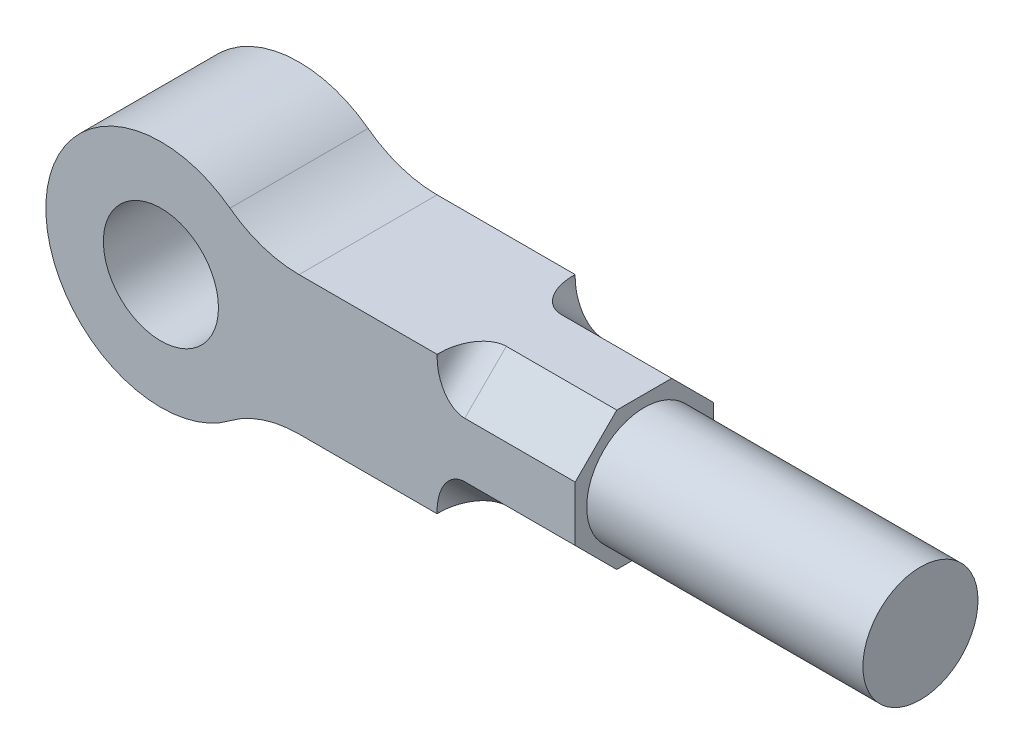
ISO-10303-21;
HEADER;
FILE_DESCRIPTION(('STEP AP214'),'2;1');
FILE_NAME('part.step','',(''),(''),'','','');
FILE_SCHEMA(('AUTOMOTIVE_DESIGN { 1 0 10303 214 1 1 1 1 }'));
ENDSEC;
DATA;
#1=APPLICATION_CONTEXT('core data for automotive mechanical design processes');
#2=APPLICATION_PROTOCOL_DEFINITION('international standard','automotive_design',2000,#1);
#3=PRODUCT_CONTEXT('',#1,'mechanical');
#4=PRODUCT('Part','Part','',(#3));
#5=PRODUCT_RELATED_PRODUCT_CATEGORY('part','',(#4));
#6=PRODUCT_DEFINITION_FORMATION('','',#4);
#7=PRODUCT_DEFINITION_CONTEXT('part definition',#1,'design');
#8=PRODUCT_DEFINITION('design','',#6,#7);
#9=PRODUCT_DEFINITION_SHAPE('','',#8);
#10=(LENGTH_UNIT() NAMED_UNIT(*) SI_UNIT(.MILLI.,.METRE.));
#11=(NAMED_UNIT(*) PLANE_ANGLE_UNIT() SI_UNIT($,.RADIAN.));
#12=(NAMED_UNIT(*) SI_UNIT($,.STERADIAN.) SOLID_ANGLE_UNIT());
#13=UNCERTAINTY_MEASURE_WITH_UNIT(LENGTH_MEASURE(1.E-05),#10,'distance_accuracy_value','');
#14=(GEOMETRIC_REPRESENTATION_CONTEXT(3) GLOBAL_UNCERTAINTY_ASSIGNED_CONTEXT((#13)) GLOBAL_UNIT_ASSIGNED_CONTEXT((#10,
#11,#12)) REPRESENTATION_CONTEXT('',''));
#15=CARTESIAN_POINT('',(0.,0.,0.));
#16=DIRECTION('',(0.,0.,1.));
#17=DIRECTION('',(1.,0.,0.));
#18=AXIS2_PLACEMENT_3D('',#15,#16,#17);
#19=CARTESIAN_POINT('',(0.,0.,600.));
#20=DIRECTION('',(0.,0.,1.));
#21=DIRECTION('',(1.,0.,0.));
#22=AXIS2_PLACEMENT_3D('',#19,#20,#21);
#23=PLANE('',#22);
#24=DIRECTION('',(0.,-1.,0.));
#25=VECTOR('',#24,1.);
#26=CARTESIAN_POINT('',(1200.,-3.83401858415997E-13,600.));
#27=LINE('',#26,#25);
#28=CARTESIAN_POINT('',(1200.,-289.105627484767,600.));
#29=VERTEX_POINT('',#28);
#30=CARTESIAN_POINT('',(1200.,-300.,600.));
#31=VERTEX_POINT('',#30);
#32=EDGE_CURVE('E282',#29,#31,#27,.T.);
#33=ORIENTED_EDGE('',*,*,#32,.F.);
#34=CARTESIAN_POINT('',(1320.,-289.105627484767,600.));
#35=DIRECTION('',(0.,0.,1.));
#36=DIRECTION('',(0.,1.,0.));
#37=AXIS2_PLACEMENT_3D('',#34,#35,#36);
#38=ELLIPSE('',#37,169.705627484772,120.);
#39=CARTESIAN_POINT('',(1320.,-119.399999999995,600.));
#40=VERTEX_POINT('',#39);
#41=EDGE_CURVE('E237',#29,#40,#38,.F.);
#42=ORIENTED_EDGE('',*,*,#41,.T.);
#43=DIRECTION('',(1.,0.,0.));
#44=VECTOR('',#43,1.);
#45=CARTESIAN_POINT('',(1200.,-119.399999999995,600.));
#46=LINE('',#45,#44);
#47=CARTESIAN_POINT('',(1800.,-119.399999999995,600.));
#48=VERTEX_POINT('',#47);
#49=EDGE_CURVE('E276',#40,#48,#46,.T.);
#50=ORIENTED_EDGE('',*,*,#49,.T.);
#51=DIRECTION('',(0.,1.,0.));
#52=VECTOR('',#51,1.);
#53=CARTESIAN_POINT('',(1800.,300.,600.));
#54=LINE('',#53,#52);
#55=CARTESIAN_POINT('',(1800.,119.399999999993,600.));
#56=VERTEX_POINT('',#55);
#57=EDGE_CURVE('E304',#48,#56,#54,.T.);
#58=ORIENTED_EDGE('',*,*,#57,.T.);
#59=DIRECTION('',(1.,0.,0.));
#60=VECTOR('',#59,1.);
#61=CARTESIAN_POINT('',(1200.,119.399999999993,600.));
#62=LINE('',#61,#60);
#63=CARTESIAN_POINT('',(1320.,119.399999999993,600.));
#64=VERTEX_POINT('',#63);
#65=EDGE_CURVE('E294',#64,#56,#62,.T.);
#66=ORIENTED_EDGE('',*,*,#65,.F.);
#67=CARTESIAN_POINT('',(1320.,289.105627484763,600.));
#68=DIRECTION('',(0.,0.,1.));
#69=DIRECTION('',(0.,1.,0.));
#70=AXIS2_PLACEMENT_3D('',#67,#68,#69);
#71=ELLIPSE('',#70,169.70562748477,120.);
#72=CARTESIAN_POINT('',(1200.,289.105627484763,600.));
#73=VERTEX_POINT('',#72);
#74=EDGE_CURVE('E11',#64,#73,#71,.F.);
#75=ORIENTED_EDGE('',*,*,#74,.T.);
#76=DIRECTION('',(0.,-1.,0.));
#77=VECTOR('',#76,1.);
#78=CARTESIAN_POINT('',(1200.,-3.83401858415997E-13,600.));
#79=LINE('',#78,#77);
#80=CARTESIAN_POINT('',(1200.,300.,600.));
#81=VERTEX_POINT('',#80);
#82=EDGE_CURVE('E263',#81,#73,#79,.T.);
#83=ORIENTED_EDGE('',*,*,#82,.F.);
#84=DIRECTION('',(-1.,0.,0.));
#85=VECTOR('',#84,1.);
#86=CARTESIAN_POINT('',(400.,300.,600.));
#87=LINE('',#86,#85);
#88=CARTESIAN_POINT('',(600.,300.,600.));
#89=VERTEX_POINT('',#88);
#90=EDGE_CURVE('E307',#81,#89,#87,.T.);
#91=ORIENTED_EDGE('',*,*,#90,.T.);
#92=CARTESIAN_POINT('',(600.,800.,600.));
#93=DIRECTION('',(0.,0.,1.));
#94=DIRECTION('',(1.,0.,0.));
#95=AXIS2_PLACEMENT_3D('',#92,#93,#94);
#96=CIRCLE('',#95,500.);
#97=CARTESIAN_POINT('',(300.,400.,600.));
#98=VERTEX_POINT('',#97);
#99=EDGE_CURVE('E205',#89,#98,#96,.F.);
#100=ORIENTED_EDGE('',*,*,#99,.T.);
#101=CARTESIAN_POINT('',(0.,0.,600.));
#102=DIRECTION('',(0.,0.,1.));
#103=DIRECTION('',(1.,0.,0.));
#104=AXIS2_PLACEMENT_3D('',#101,#102,#103);
#105=CIRCLE('',#104,500.);
#106=CARTESIAN_POINT('',(300.,-400.,600.));
#107=VERTEX_POINT('',#106);
#108=EDGE_CURVE('E310',#98,#107,#105,.T.);
#109=ORIENTED_EDGE('',*,*,#108,.T.);
#110=CARTESIAN_POINT('',(600.,-800.,600.));
#111=DIRECTION('',(0.,0.,1.));
#112=DIRECTION('',(1.,0.,0.));
#113=AXIS2_PLACEMENT_3D('',#110,#111,#112);
#114=CIRCLE('',#113,500.);
#115=CARTESIAN_POINT('',(600.,-300.,600.));
#116=VERTEX_POINT('',#115);
#117=EDGE_CURVE('E214',#107,#116,#114,.F.);
#118=ORIENTED_EDGE('',*,*,#117,.T.);
#119=DIRECTION('',(1.,0.,0.));
#120=VECTOR('',#119,1.);
#121=CARTESIAN_POINT('',(400.,-300.,600.));
#122=LINE('',#121,#120);
#123=EDGE_CURVE('E196',#116,#31,#122,.T.);
#124=ORIENTED_EDGE('',*,*,#123,.T.);
#125=EDGE_LOOP('',(#33,#42,#50,#58,#66,#75,#83,#91,#100,#109,#118,#124));
#126=FACE_BOUND('',#125,.T.);
#127=CARTESIAN_POINT('',(0.,0.,600.));
#128=DIRECTION('',(0.,0.,1.));
#129=DIRECTION('',(1.,0.,0.));
#130=AXIS2_PLACEMENT_3D('',#127,#128,#129);
#131=CIRCLE('',#130,250.);
#132=CARTESIAN_POINT('',(250.,0.,600.));
#133=VERTEX_POINT('',#132);
#134=EDGE_CURVE('E299',#133,#133,#131,.T.);
#135=ORIENTED_EDGE('',*,*,#134,.F.);
#136=EDGE_LOOP('',(#135));
#137=FACE_BOUND('',#136,.T.);
#138=ADVANCED_FACE('F39',(#126,#137),#23,.T.);
#139=CARTESIAN_POINT('',(0.,0.,0.));
#140=DIRECTION('',(0.,0.,1.));
#141=DIRECTION('',(1.,0.,0.));
#142=AXIS2_PLACEMENT_3D('',#139,#140,#141);
#143=PLANE('',#142);
#144=DIRECTION('',(0.,1.,0.));
#145=VECTOR('',#144,1.);
#146=CARTESIAN_POINT('',(1200.,-3.83401858415997E-13,0.));
#147=LINE('',#146,#145);
#148=CARTESIAN_POINT('',(1200.,289.105627484771,0.));
#149=VERTEX_POINT('',#148);
#150=CARTESIAN_POINT('',(1200.,300.,0.));
#151=VERTEX_POINT('',#150);
#152=EDGE_CURVE('E173',#149,#151,#147,.T.);
#153=ORIENTED_EDGE('',*,*,#152,.F.);
#154=CARTESIAN_POINT('',(1320.,289.105627484771,0.));
#155=DIRECTION('',(0.,0.,1.));
#156=DIRECTION('',(0.,-1.,0.));
#157=AXIS2_PLACEMENT_3D('',#154,#155,#156);
#158=ELLIPSE('',#157,169.705627484771,120.);
#159=CARTESIAN_POINT('',(1320.,119.4,0.));
#160=VERTEX_POINT('',#159);
#161=EDGE_CURVE('E245',#149,#160,#158,.T.);
#162=ORIENTED_EDGE('',*,*,#161,.T.);
#163=DIRECTION('',(1.,0.,0.));
#164=VECTOR('',#163,1.);
#165=CARTESIAN_POINT('',(1200.,119.4,0.));
#166=LINE('',#165,#164);
#167=CARTESIAN_POINT('',(1800.,119.4,0.));
#168=VERTEX_POINT('',#167);
#169=EDGE_CURVE('E172',#160,#168,#166,.T.);
#170=ORIENTED_EDGE('',*,*,#169,.T.);
#171=DIRECTION('',(0.,1.,0.));
#172=VECTOR('',#171,1.);
#173=CARTESIAN_POINT('',(1800.,300.,0.));
#174=LINE('',#173,#172);
#175=CARTESIAN_POINT('',(1800.,-119.400000000005,0.));
#176=VERTEX_POINT('',#175);
#177=EDGE_CURVE('E182',#176,#168,#174,.T.);
#178=ORIENTED_EDGE('',*,*,#177,.F.);
#179=DIRECTION('',(1.,0.,0.));
#180=VECTOR('',#179,1.);
#181=CARTESIAN_POINT('',(1200.,-119.400000000005,0.));
#182=LINE('',#181,#180);
#183=CARTESIAN_POINT('',(1320.,-119.400000000005,0.));
#184=VERTEX_POINT('',#183);
#185=EDGE_CURVE('E273',#184,#176,#182,.T.);
#186=ORIENTED_EDGE('',*,*,#185,.F.);
#187=CARTESIAN_POINT('',(1320.,-289.105627484776,0.));
#188=DIRECTION('',(0.,0.,1.));
#189=DIRECTION('',(0.,-1.,0.));
#190=AXIS2_PLACEMENT_3D('',#187,#188,#189);
#191=ELLIPSE('',#190,169.705627484771,120.);
#192=CARTESIAN_POINT('',(1200.,-289.105627484776,0.));
#193=VERTEX_POINT('',#192);
#194=EDGE_CURVE('E243',#184,#193,#191,.T.);
#195=ORIENTED_EDGE('',*,*,#194,.T.);
#196=DIRECTION('',(0.,1.,0.));
#197=VECTOR('',#196,1.);
#198=CARTESIAN_POINT('',(1200.,-3.83401858415997E-13,0.));
#199=LINE('',#198,#197);
#200=CARTESIAN_POINT('',(1200.,-300.,0.));
#201=VERTEX_POINT('',#200);
#202=EDGE_CURVE('E267',#201,#193,#199,.T.);
#203=ORIENTED_EDGE('',*,*,#202,.F.);
#204=DIRECTION('',(1.,0.,0.));
#205=VECTOR('',#204,1.);
#206=CARTESIAN_POINT('',(400.,-300.,0.));
#207=LINE('',#206,#205);
#208=CARTESIAN_POINT('',(600.,-300.,0.));
#209=VERTEX_POINT('',#208);
#210=EDGE_CURVE('E308',#209,#201,#207,.T.);
#211=ORIENTED_EDGE('',*,*,#210,.F.);
#212=CARTESIAN_POINT('',(600.,-800.,0.));
#213=DIRECTION('',(0.,0.,1.));
#214=DIRECTION('',(1.,0.,0.));
#215=AXIS2_PLACEMENT_3D('',#212,#213,#214);
#216=CIRCLE('',#215,500.);
#217=CARTESIAN_POINT('',(300.,-400.,0.));
#218=VERTEX_POINT('',#217);
#219=EDGE_CURVE('E212',#209,#218,#216,.T.);
#220=ORIENTED_EDGE('',*,*,#219,.T.);
#221=CARTESIAN_POINT('',(0.,0.,0.));
#222=DIRECTION('',(0.,0.,1.));
#223=DIRECTION('',(1.,0.,0.));
#224=AXIS2_PLACEMENT_3D('',#221,#222,#223);
#225=CIRCLE('',#224,500.);
#226=CARTESIAN_POINT('',(300.,400.,0.));
#227=VERTEX_POINT('',#226);
#228=EDGE_CURVE('E318',#227,#218,#225,.T.);
#229=ORIENTED_EDGE('',*,*,#228,.F.);
#230=CARTESIAN_POINT('',(600.,800.,0.));
#231=DIRECTION('',(0.,0.,1.));
#232=DIRECTION('',(1.,0.,0.));
#233=AXIS2_PLACEMENT_3D('',#230,#231,#232);
#234=CIRCLE('',#233,500.);
#235=CARTESIAN_POINT('',(600.,300.,0.));
#236=VERTEX_POINT('',#235);
#237=EDGE_CURVE('E202',#227,#236,#234,.T.);
#238=ORIENTED_EDGE('',*,*,#237,.T.);
#239=DIRECTION('',(-1.,0.,0.));
#240=VECTOR('',#239,1.);
#241=CARTESIAN_POINT('',(400.,300.,0.));
#242=LINE('',#241,#240);
#243=EDGE_CURVE('E316',#151,#236,#242,.T.);
#244=ORIENTED_EDGE('',*,*,#243,.F.);
#245=EDGE_LOOP('',(#153,#162,#170,#178,#186,#195,#203,#211,#220,#229,#238,#244));
#246=FACE_BOUND('',#245,.T.);
#247=CARTESIAN_POINT('',(0.,0.,0.));
#248=DIRECTION('',(0.,0.,1.));
#249=DIRECTION('',(1.,0.,0.));
#250=AXIS2_PLACEMENT_3D('',#247,#248,#249);
#251=CIRCLE('',#250,250.);
#252=CARTESIAN_POINT('',(250.,0.,0.));
#253=VERTEX_POINT('',#252);
#254=EDGE_CURVE('E297',#253,#253,#251,.T.);
#255=ORIENTED_EDGE('',*,*,#254,.T.);
#256=EDGE_LOOP('',(#255));
#257=FACE_BOUND('',#256,.T.);
#258=ADVANCED_FACE('F259',(#246,#257),#143,.F.);
#259=CARTESIAN_POINT('',(1800.,300.,600.));
#260=DIRECTION('',(-1.,0.,0.));
#261=DIRECTION('',(0.,-1.,0.));
#262=AXIS2_PLACEMENT_3D('',#259,#260,#261);
#263=PLANE('',#262);
#264=CARTESIAN_POINT('',(1800.,-6.66133814775094E-13,300.));
#265=DIRECTION('',(-1.,0.,0.));
#266=DIRECTION('',(0.,-1.,0.));
#267=AXIS2_PLACEMENT_3D('',#264,#265,#266);
#268=CIRCLE('',#267,250.);
#269=CARTESIAN_POINT('',(1800.,-250.000000000001,300.));
#270=VERTEX_POINT('',#269);
#271=EDGE_CURVE('E216',#270,#270,#268,.F.);
#272=ORIENTED_EDGE('',*,*,#271,.F.);
#273=EDGE_LOOP('',(#272));
#274=FACE_BOUND('',#273,.T.);
#275=ORIENTED_EDGE('',*,*,#177,.T.);
#276=DIRECTION('',(0.,-0.707106781186547,-0.707106781186548));
#277=VECTOR('',#276,1.);
#278=CARTESIAN_POINT('',(1800.,59.6999999999999,-59.7000000000003));
#279=LINE('',#278,#277);
#280=CARTESIAN_POINT('',(1800.,300.,180.6));
#281=VERTEX_POINT('',#280);
#282=EDGE_CURVE('E166',#281,#168,#279,.T.);
#283=ORIENTED_EDGE('',*,*,#282,.F.);
#284=DIRECTION('',(0.,0.,-1.));
#285=VECTOR('',#284,1.);
#286=CARTESIAN_POINT('',(1800.,300.,600.));
#287=LINE('',#286,#285);
#288=CARTESIAN_POINT('',(1800.,300.,419.399999999989));
#289=VERTEX_POINT('',#288);
#290=EDGE_CURVE('E179',#289,#281,#287,.T.);
#291=ORIENTED_EDGE('',*,*,#290,.F.);
#292=DIRECTION('',(0.,0.707106781186541,-0.707106781186554));
#293=VECTOR('',#292,1.);
#294=CARTESIAN_POINT('',(1800.,359.699999999997,359.699999999991));
#295=LINE('',#294,#293);
#296=EDGE_CURVE('E261',#56,#289,#295,.T.);
#297=ORIENTED_EDGE('',*,*,#296,.F.);
#298=ORIENTED_EDGE('',*,*,#57,.F.);
#299=DIRECTION('',(0.,0.707106781186552,0.707106781186544));
#300=VECTOR('',#299,1.);
#301=CARTESIAN_POINT('',(1800.,-359.699999999997,359.700000000001));
#302=LINE('',#301,#300);
#303=CARTESIAN_POINT('',(1800.,-300.,419.399999999997));
#304=VERTEX_POINT('',#303);
#305=EDGE_CURVE('E283',#304,#48,#302,.T.);
#306=ORIENTED_EDGE('',*,*,#305,.F.);
#307=DIRECTION('',(0.,0.,-1.));
#308=VECTOR('',#307,1.);
#309=CARTESIAN_POINT('',(1800.,-300.,600.));
#310=LINE('',#309,#308);
#311=CARTESIAN_POINT('',(1800.,-300.,180.599999999996));
#312=VERTEX_POINT('',#311);
#313=EDGE_CURVE('E190',#304,#312,#310,.T.);
#314=ORIENTED_EDGE('',*,*,#313,.T.);
#315=DIRECTION('',(0.,-0.707106781186546,0.707106781186549));
#316=VECTOR('',#315,1.);
#317=CARTESIAN_POINT('',(1800.,-59.700000000003,-59.7000000000021));
#318=LINE('',#317,#316);
#319=EDGE_CURVE('E271',#176,#312,#318,.T.);
#320=ORIENTED_EDGE('',*,*,#319,.F.);
#321=EDGE_LOOP('',(#275,#283,#291,#297,#298,#306,#314,#320));
#322=FACE_BOUND('',#321,.T.);
#323=ADVANCED_FACE('F177',(#274,#322),#263,.F.);
#324=CARTESIAN_POINT('',(400.,300.,600.));
#325=DIRECTION('',(0.,-1.,0.));
#326=DIRECTION('',(0.,0.,-1.));
#327=AXIS2_PLACEMENT_3D('',#324,#325,#326);
#328=PLANE('',#327);
#329=ORIENTED_EDGE('',*,*,#290,.T.);
#330=DIRECTION('',(1.,0.,0.));
#331=VECTOR('',#330,1.);
#332=CARTESIAN_POINT('',(1200.,300.,180.6));
#333=LINE('',#332,#331);
#334=CARTESIAN_POINT('',(1320.,300.,180.6));
#335=VERTEX_POINT('',#334);
#336=EDGE_CURVE('E162',#335,#281,#333,.T.);
#337=ORIENTED_EDGE('',*,*,#336,.F.);
#338=CARTESIAN_POINT('',(1320.,300.,10.8943725152286));
#339=DIRECTION('',(0.,-1.,0.));
#340=DIRECTION('',(0.,0.,-1.));
#341=AXIS2_PLACEMENT_3D('',#338,#339,#340);
#342=ELLIPSE('',#341,169.705627484772,120.);
#343=CARTESIAN_POINT('',(1200.,300.,10.8943725152288));
#344=VERTEX_POINT('',#343);
#345=EDGE_CURVE('E247',#335,#344,#342,.T.);
#346=ORIENTED_EDGE('',*,*,#345,.T.);
#347=DIRECTION('',(0.,0.,1.));
#348=VECTOR('',#347,1.);
#349=CARTESIAN_POINT('',(1200.,300.,0.));
#350=LINE('',#349,#348);
#351=EDGE_CURVE('E183',#151,#344,#350,.T.);
#352=ORIENTED_EDGE('',*,*,#351,.F.);
#353=ORIENTED_EDGE('',*,*,#243,.T.);
#354=DIRECTION('',(0.,0.,1.));
#355=VECTOR('',#354,1.);
#356=CARTESIAN_POINT('',(600.,300.,600.));
#357=LINE('',#356,#355);
#358=EDGE_CURVE('E193',#236,#89,#357,.T.);
#359=ORIENTED_EDGE('',*,*,#358,.T.);
#360=ORIENTED_EDGE('',*,*,#90,.F.);
#361=DIRECTION('',(0.,0.,1.));
#362=VECTOR('',#361,1.);
#363=CARTESIAN_POINT('',(1200.,300.,0.));
#364=LINE('',#363,#362);
#365=CARTESIAN_POINT('',(1200.,300.,589.105627484763));
#366=VERTEX_POINT('',#365);
#367=EDGE_CURVE('E293',#366,#81,#364,.T.);
#368=ORIENTED_EDGE('',*,*,#367,.F.);
#369=CARTESIAN_POINT('',(1320.,300.,589.105627484763));
#370=DIRECTION('',(0.,-1.,0.));
#371=DIRECTION('',(0.,0.,-1.));
#372=AXIS2_PLACEMENT_3D('',#369,#370,#371);
#373=ELLIPSE('',#372,169.705627484773,120.);
#374=CARTESIAN_POINT('',(1320.,300.,419.399999999989));
#375=VERTEX_POINT('',#374);
#376=EDGE_CURVE('E47',#366,#375,#373,.T.);
#377=ORIENTED_EDGE('',*,*,#376,.T.);
#378=DIRECTION('',(1.,0.,0.));
#379=VECTOR('',#378,1.);
#380=CARTESIAN_POINT('',(1200.,300.,419.399999999989));
#381=LINE('',#380,#379);
#382=EDGE_CURVE('E187',#375,#289,#381,.T.);
#383=ORIENTED_EDGE('',*,*,#382,.T.);
#384=EDGE_LOOP('',(#329,#337,#346,#352,#353,#359,#360,#368,#377,#383));
#385=FACE_BOUND('',#384,.T.);
#386=ADVANCED_FACE('F186',(#385),#328,.F.);
#387=CARTESIAN_POINT('',(0.,0.,600.));
#388=DIRECTION('',(0.,0.,-1.));
#389=DIRECTION('',(-1.,0.,0.));
#390=AXIS2_PLACEMENT_3D('',#387,#388,#389);
#391=CYLINDRICAL_SURFACE('',#390,500.);
#392=ORIENTED_EDGE('',*,*,#228,.T.);
#393=DIRECTION('',(0.,0.,-1.));
#394=VECTOR('',#393,1.);
#395=CARTESIAN_POINT('',(300.,-400.,600.));
#396=LINE('',#395,#394);
#397=EDGE_CURVE('E210',#218,#107,#396,.F.);
#398=ORIENTED_EDGE('',*,*,#397,.T.);
#399=ORIENTED_EDGE('',*,*,#108,.F.);
#400=DIRECTION('',(0.,0.,-1.));
#401=VECTOR('',#400,1.);
#402=CARTESIAN_POINT('',(300.,400.,600.));
#403=LINE('',#402,#401);
#404=EDGE_CURVE('E189',#98,#227,#403,.T.);
#405=ORIENTED_EDGE('',*,*,#404,.T.);
#406=EDGE_LOOP('',(#392,#398,#399,#405));
#407=FACE_BOUND('',#406,.T.);
#408=ADVANCED_FACE('F363',(#407),#391,.T.);
#409=CARTESIAN_POINT('',(400.,-300.,600.));
#410=DIRECTION('',(0.,1.,0.));
#411=DIRECTION('',(0.,0.,1.));
#412=AXIS2_PLACEMENT_3D('',#409,#410,#411);
#413=PLANE('',#412);
#414=DIRECTION('',(0.,0.,-1.));
#415=VECTOR('',#414,1.);
#416=CARTESIAN_POINT('',(1200.,-300.,0.));
#417=LINE('',#416,#415);
#418=CARTESIAN_POINT('',(1200.,-300.,10.8943725152242));
#419=VERTEX_POINT('',#418);
#420=EDGE_CURVE('E270',#419,#201,#417,.T.);
#421=ORIENTED_EDGE('',*,*,#420,.F.);
#422=CARTESIAN_POINT('',(1320.,-300.,10.8943725152244));
#423=DIRECTION('',(0.,1.,0.));
#424=DIRECTION('',(0.,0.,1.));
#425=AXIS2_PLACEMENT_3D('',#422,#423,#424);
#426=ELLIPSE('',#425,169.705627484772,120.);
#427=CARTESIAN_POINT('',(1320.,-300.,180.599999999996));
#428=VERTEX_POINT('',#427);
#429=EDGE_CURVE('E241',#419,#428,#426,.T.);
#430=ORIENTED_EDGE('',*,*,#429,.T.);
#431=DIRECTION('',(1.,0.,0.));
#432=VECTOR('',#431,1.);
#433=CARTESIAN_POINT('',(1200.,-300.,180.599999999996));
#434=LINE('',#433,#432);
#435=EDGE_CURVE('E184',#428,#312,#434,.T.);
#436=ORIENTED_EDGE('',*,*,#435,.T.);
#437=ORIENTED_EDGE('',*,*,#313,.F.);
#438=DIRECTION('',(1.,0.,0.));
#439=VECTOR('',#438,1.);
#440=CARTESIAN_POINT('',(1200.,-300.,419.399999999997));
#441=LINE('',#440,#439);
#442=CARTESIAN_POINT('',(1320.,-300.,419.399999999997));
#443=VERTEX_POINT('',#442);
#444=EDGE_CURVE('E285',#443,#304,#441,.T.);
#445=ORIENTED_EDGE('',*,*,#444,.F.);
#446=CARTESIAN_POINT('',(1320.,-300.,589.105627484768));
#447=DIRECTION('',(0.,1.,0.));
#448=DIRECTION('',(0.,0.,1.));
#449=AXIS2_PLACEMENT_3D('',#446,#447,#448);
#450=ELLIPSE('',#449,169.70562748477,120.);
#451=CARTESIAN_POINT('',(1200.,-300.,589.105627484768));
#452=VERTEX_POINT('',#451);
#453=EDGE_CURVE('E239',#443,#452,#450,.T.);
#454=ORIENTED_EDGE('',*,*,#453,.T.);
#455=DIRECTION('',(0.,0.,-1.));
#456=VECTOR('',#455,1.);
#457=CARTESIAN_POINT('',(1200.,-300.,0.));
#458=LINE('',#457,#456);
#459=EDGE_CURVE('E279',#31,#452,#458,.T.);
#460=ORIENTED_EDGE('',*,*,#459,.F.);
#461=ORIENTED_EDGE('',*,*,#123,.F.);
#462=DIRECTION('',(0.,0.,1.));
#463=VECTOR('',#462,1.);
#464=CARTESIAN_POINT('',(600.,-300.,0.));
#465=LINE('',#464,#463);
#466=EDGE_CURVE('E207',#116,#209,#465,.F.);
#467=ORIENTED_EDGE('',*,*,#466,.T.);
#468=ORIENTED_EDGE('',*,*,#210,.T.);
#469=EDGE_LOOP('',(#421,#430,#436,#437,#445,#454,#460,#461,#467,#468));
#470=FACE_BOUND('',#469,.T.);
#471=ADVANCED_FACE('F324',(#470),#413,.F.);
#472=CARTESIAN_POINT('',(0.,0.,600.));
#473=DIRECTION('',(0.,0.,-1.));
#474=DIRECTION('',(-1.,0.,0.));
#475=AXIS2_PLACEMENT_3D('',#472,#473,#474);
#476=CYLINDRICAL_SURFACE('',#475,250.);
#477=ORIENTED_EDGE('',*,*,#134,.T.);
#478=EDGE_LOOP('',(#477));
#479=FACE_BOUND('',#478,.T.);
#480=ORIENTED_EDGE('',*,*,#254,.F.);
#481=EDGE_LOOP('',(#480));
#482=FACE_BOUND('',#481,.T.);
#483=ADVANCED_FACE('F388',(#479,#482),#476,.F.);
#484=CARTESIAN_POINT('',(600.,800.,600.));
#485=DIRECTION('',(0.,0.,-1.));
#486=DIRECTION('',(-1.,0.,0.));
#487=AXIS2_PLACEMENT_3D('',#484,#485,#486);
#488=CYLINDRICAL_SURFACE('',#487,500.);
#489=ORIENTED_EDGE('',*,*,#99,.F.);
#490=ORIENTED_EDGE('',*,*,#358,.F.);
#491=ORIENTED_EDGE('',*,*,#237,.F.);
#492=ORIENTED_EDGE('',*,*,#404,.F.);
#493=EDGE_LOOP('',(#489,#490,#491,#492));
#494=FACE_BOUND('',#493,.T.);
#495=ADVANCED_FACE('F370',(#494),#488,.F.);
#496=CARTESIAN_POINT('',(600.,-800.,600.));
#497=DIRECTION('',(0.,0.,-1.));
#498=DIRECTION('',(-1.,0.,0.));
#499=AXIS2_PLACEMENT_3D('',#496,#497,#498);
#500=CYLINDRICAL_SURFACE('',#499,500.);
#501=ORIENTED_EDGE('',*,*,#117,.F.);
#502=ORIENTED_EDGE('',*,*,#397,.F.);
#503=ORIENTED_EDGE('',*,*,#219,.F.);
#504=ORIENTED_EDGE('',*,*,#466,.F.);
#505=EDGE_LOOP('',(#501,#502,#503,#504));
#506=FACE_BOUND('',#505,.T.);
#507=ADVANCED_FACE('F359',(#506),#500,.F.);
#508=CARTESIAN_POINT('',(1200.,359.699999999997,359.699999999991));
#509=DIRECTION('',(0.,-0.707106781186554,-0.707106781186541));
#510=DIRECTION('',(0.,0.707106781186541,-0.707106781186554));
#511=AXIS2_PLACEMENT_3D('',#508,#509,#510);
#512=PLANE('',#511);
#513=ORIENTED_EDGE('',*,*,#382,.F.);
#514=DIRECTION('',(0.,0.707106781186541,-0.707106781186554));
#515=VECTOR('',#514,1.);
#516=CARTESIAN_POINT('',(1320.,359.699999999997,359.699999999991));
#517=LINE('',#516,#515);
#518=EDGE_CURVE('E54',#375,#64,#517,.F.);
#519=ORIENTED_EDGE('',*,*,#518,.T.);
#520=ORIENTED_EDGE('',*,*,#65,.T.);
#521=ORIENTED_EDGE('',*,*,#296,.T.);
#522=EDGE_LOOP('',(#513,#519,#520,#521));
#523=FACE_BOUND('',#522,.T.);
#524=ADVANCED_FACE('F404',(#523),#512,.F.);
#525=CARTESIAN_POINT('',(1200.,-3.83401858415997E-13,0.));
#526=DIRECTION('',(1.,0.,0.));
#527=DIRECTION('',(0.,1.,0.));
#528=AXIS2_PLACEMENT_3D('',#525,#526,#527);
#529=PLANE('',#528);
#530=ORIENTED_EDGE('',*,*,#82,.T.);
#531=DIRECTION('',(0.,0.707106781186541,-0.707106781186554));
#532=VECTOR('',#531,1.);
#533=CARTESIAN_POINT('',(1200.,444.552813742384,444.552813742376));
#534=LINE('',#533,#532);
#535=EDGE_CURVE('E233',#73,#366,#534,.T.);
#536=ORIENTED_EDGE('',*,*,#535,.T.);
#537=ORIENTED_EDGE('',*,*,#367,.T.);
#538=EDGE_LOOP('',(#530,#536,#537));
#539=FACE_BOUND('',#538,.T.);
#540=ADVANCED_FACE('F372',(#539),#529,.T.);
#541=CARTESIAN_POINT('',(1200.,-359.699999999997,359.700000000001));
#542=DIRECTION('',(0.,0.707106781186543,-0.707106781186552));
#543=DIRECTION('',(0.,0.707106781186552,0.707106781186543));
#544=AXIS2_PLACEMENT_3D('',#541,#542,#543);
#545=PLANE('',#544);
#546=ORIENTED_EDGE('',*,*,#49,.F.);
#547=DIRECTION('',(0.,0.707106781186552,0.707106781186543));
#548=VECTOR('',#547,1.);
#549=CARTESIAN_POINT('',(1320.,-359.699999999997,359.700000000001));
#550=LINE('',#549,#548);
#551=EDGE_CURVE('E222',#40,#443,#550,.F.);
#552=ORIENTED_EDGE('',*,*,#551,.T.);
#553=ORIENTED_EDGE('',*,*,#444,.T.);
#554=ORIENTED_EDGE('',*,*,#305,.T.);
#555=EDGE_LOOP('',(#546,#552,#553,#554));
#556=FACE_BOUND('',#555,.T.);
#557=ADVANCED_FACE('F454',(#556),#545,.F.);
#558=CARTESIAN_POINT('',(1200.,-3.83401858415997E-13,0.));
#559=DIRECTION('',(1.,0.,0.));
#560=DIRECTION('',(0.,1.,0.));
#561=AXIS2_PLACEMENT_3D('',#558,#559,#560);
#562=PLANE('',#561);
#563=ORIENTED_EDGE('',*,*,#459,.T.);
#564=DIRECTION('',(0.,0.707106781186552,0.707106781186543));
#565=VECTOR('',#564,1.);
#566=CARTESIAN_POINT('',(1200.,-444.552813742382,444.552813742387));
#567=LINE('',#566,#565);
#568=EDGE_CURVE('E219',#452,#29,#567,.T.);
#569=ORIENTED_EDGE('',*,*,#568,.T.);
#570=ORIENTED_EDGE('',*,*,#32,.T.);
#571=EDGE_LOOP('',(#563,#569,#570));
#572=FACE_BOUND('',#571,.T.);
#573=ADVANCED_FACE('F353',(#572),#562,.T.);
#574=CARTESIAN_POINT('',(1200.,-59.7000000000028,-59.7000000000021));
#575=DIRECTION('',(0.,0.707106781186549,0.707106781186546));
#576=DIRECTION('',(0.,-0.707106781186546,0.707106781186549));
#577=AXIS2_PLACEMENT_3D('',#574,#575,#576);
#578=PLANE('',#577);
#579=ORIENTED_EDGE('',*,*,#435,.F.);
#580=DIRECTION('',(0.,-0.707106781186546,0.707106781186549));
#581=VECTOR('',#580,1.);
#582=CARTESIAN_POINT('',(1320.,-59.7000000000028,-59.7000000000021));
#583=LINE('',#582,#581);
#584=EDGE_CURVE('E227',#428,#184,#583,.F.);
#585=ORIENTED_EDGE('',*,*,#584,.T.);
#586=ORIENTED_EDGE('',*,*,#185,.T.);
#587=ORIENTED_EDGE('',*,*,#319,.T.);
#588=EDGE_LOOP('',(#579,#585,#586,#587));
#589=FACE_BOUND('',#588,.T.);
#590=ADVANCED_FACE('F340',(#589),#578,.F.);
#591=CARTESIAN_POINT('',(1200.,-3.83401858415997E-13,0.));
#592=DIRECTION('',(1.,0.,0.));
#593=DIRECTION('',(0.,1.,0.));
#594=AXIS2_PLACEMENT_3D('',#591,#592,#593);
#595=PLANE('',#594);
#596=ORIENTED_EDGE('',*,*,#202,.T.);
#597=DIRECTION('',(0.,-0.707106781186546,0.707106781186549));
#598=VECTOR('',#597,1.);
#599=CARTESIAN_POINT('',(1200.,-144.552813742389,-144.552813742388));
#600=LINE('',#599,#598);
#601=EDGE_CURVE('E224',#193,#419,#600,.T.);
#602=ORIENTED_EDGE('',*,*,#601,.T.);
#603=ORIENTED_EDGE('',*,*,#420,.T.);
#604=EDGE_LOOP('',(#596,#602,#603));
#605=FACE_BOUND('',#604,.T.);
#606=ADVANCED_FACE('F333',(#605),#595,.T.);
#607=CARTESIAN_POINT('',(1200.,59.7000000000001,-59.7000000000003));
#608=DIRECTION('',(0.,-0.707106781186548,0.707106781186547));
#609=DIRECTION('',(0.,-0.707106781186547,-0.707106781186548));
#610=AXIS2_PLACEMENT_3D('',#607,#608,#609);
#611=PLANE('',#610);
#612=ORIENTED_EDGE('',*,*,#169,.F.);
#613=DIRECTION('',(0.,-0.707106781186547,-0.707106781186548));
#614=VECTOR('',#613,1.);
#615=CARTESIAN_POINT('',(1320.,59.7,-59.7000000000003));
#616=LINE('',#615,#614);
#617=EDGE_CURVE('E169',#160,#335,#616,.F.);
#618=ORIENTED_EDGE('',*,*,#617,.T.);
#619=ORIENTED_EDGE('',*,*,#336,.T.);
#620=ORIENTED_EDGE('',*,*,#282,.T.);
#621=EDGE_LOOP('',(#612,#618,#619,#620));
#622=FACE_BOUND('',#621,.T.);
#623=ADVANCED_FACE('F165',(#622),#611,.F.);
#624=CARTESIAN_POINT('',(1200.,-3.83401858415997E-13,0.));
#625=DIRECTION('',(1.,0.,0.));
#626=DIRECTION('',(0.,1.,0.));
#627=AXIS2_PLACEMENT_3D('',#624,#625,#626);
#628=PLANE('',#627);
#629=ORIENTED_EDGE('',*,*,#351,.T.);
#630=DIRECTION('',(0.,-0.707106781186547,-0.707106781186548));
#631=VECTOR('',#630,1.);
#632=CARTESIAN_POINT('',(1200.,144.552813742386,-144.552813742386));
#633=LINE('',#632,#631);
#634=EDGE_CURVE('E229',#344,#149,#633,.T.);
#635=ORIENTED_EDGE('',*,*,#634,.T.);
#636=ORIENTED_EDGE('',*,*,#152,.T.);
#637=EDGE_LOOP('',(#629,#635,#636));
#638=FACE_BOUND('',#637,.T.);
#639=ADVANCED_FACE('F254',(#638),#628,.T.);
#640=CARTESIAN_POINT('',(3000.,-1.11022302462516E-12,300.));
#641=DIRECTION('',(-1.,0.,0.));
#642=DIRECTION('',(0.,-1.,0.));
#643=AXIS2_PLACEMENT_3D('',#640,#641,#642);
#644=CYLINDRICAL_SURFACE('',#643,250.);
#645=CARTESIAN_POINT('',(3000.,-1.11022302462516E-12,300.));
#646=DIRECTION('',(1.,0.,0.));
#647=DIRECTION('',(0.,1.,0.));
#648=AXIS2_PLACEMENT_3D('',#645,#646,#647);
#649=CIRCLE('',#648,250.);
#650=CARTESIAN_POINT('',(3000.,249.999999999999,300.));
#651=VERTEX_POINT('',#650);
#652=EDGE_CURVE('E288',#651,#651,#649,.T.);
#653=ORIENTED_EDGE('',*,*,#652,.F.);
#654=EDGE_LOOP('',(#653));
#655=FACE_BOUND('',#654,.T.);
#656=ORIENTED_EDGE('',*,*,#271,.T.);
#657=EDGE_LOOP('',(#656));
#658=FACE_BOUND('',#657,.T.);
#659=ADVANCED_FACE('F428',(#655,#658),#644,.T.);
#660=CARTESIAN_POINT('',(3000.,-1.04953567319109E-12,0.));
#661=DIRECTION('',(1.,0.,0.));
#662=DIRECTION('',(0.,1.,0.));
#663=AXIS2_PLACEMENT_3D('',#660,#661,#662);
#664=PLANE('',#663);
#665=ORIENTED_EDGE('',*,*,#652,.T.);
#666=EDGE_LOOP('',(#665));
#667=FACE_BOUND('',#666,.T.);
#668=ADVANCED_FACE('F407',(#667),#664,.T.);
#669=CARTESIAN_POINT('',(1320.,-444.552813742382,444.552813742387));
#670=DIRECTION('',(0.,0.707106781186552,0.707106781186543));
#671=DIRECTION('',(0.,-0.707106781186543,0.707106781186552));
#672=AXIS2_PLACEMENT_3D('',#669,#670,#671);
#673=CYLINDRICAL_SURFACE('',#672,120.);
#674=ORIENTED_EDGE('',*,*,#453,.F.);
#675=ORIENTED_EDGE('',*,*,#551,.F.);
#676=ORIENTED_EDGE('',*,*,#41,.F.);
#677=ORIENTED_EDGE('',*,*,#568,.F.);
#678=EDGE_LOOP('',(#674,#675,#676,#677));
#679=FACE_BOUND('',#678,.T.);
#680=ADVANCED_FACE('F350',(#679),#673,.F.);
#681=CARTESIAN_POINT('',(1320.,-144.552813742389,-144.552813742388));
#682=DIRECTION('',(0.,-0.707106781186546,0.707106781186549));
#683=DIRECTION('',(0.,-0.707106781186549,-0.707106781186546));
#684=AXIS2_PLACEMENT_3D('',#681,#682,#683);
#685=CYLINDRICAL_SURFACE('',#684,120.);
#686=ORIENTED_EDGE('',*,*,#194,.F.);
#687=ORIENTED_EDGE('',*,*,#584,.F.);
#688=ORIENTED_EDGE('',*,*,#429,.F.);
#689=ORIENTED_EDGE('',*,*,#601,.F.);
#690=EDGE_LOOP('',(#686,#687,#688,#689));
#691=FACE_BOUND('',#690,.T.);
#692=ADVANCED_FACE('F335',(#691),#685,.F.);
#693=CARTESIAN_POINT('',(1320.,144.552813742386,-144.552813742386));
#694=DIRECTION('',(0.,-0.707106781186547,-0.707106781186548));
#695=DIRECTION('',(0.,0.707106781186548,-0.707106781186547));
#696=AXIS2_PLACEMENT_3D('',#693,#694,#695);
#697=CYLINDRICAL_SURFACE('',#696,120.);
#698=ORIENTED_EDGE('',*,*,#345,.F.);
#699=ORIENTED_EDGE('',*,*,#617,.F.);
#700=ORIENTED_EDGE('',*,*,#161,.F.);
#701=ORIENTED_EDGE('',*,*,#634,.F.);
#702=EDGE_LOOP('',(#698,#699,#700,#701));
#703=FACE_BOUND('',#702,.T.);
#704=ADVANCED_FACE('F257',(#703),#697,.F.);
#705=CARTESIAN_POINT('',(1320.,444.552813742384,444.552813742376));
#706=DIRECTION('',(0.,0.707106781186541,-0.707106781186554));
#707=DIRECTION('',(0.,0.707106781186554,0.707106781186541));
#708=AXIS2_PLACEMENT_3D('',#705,#706,#707);
#709=CYLINDRICAL_SURFACE('',#708,120.);
#710=ORIENTED_EDGE('',*,*,#74,.F.);
#711=ORIENTED_EDGE('',*,*,#518,.F.);
#712=ORIENTED_EDGE('',*,*,#376,.F.);
#713=ORIENTED_EDGE('',*,*,#535,.F.);
#714=EDGE_LOOP('',(#710,#711,#712,#713));
#715=FACE_BOUND('',#714,.T.);
#716=ADVANCED_FACE('F41',(#715),#709,.F.);
#717=CLOSED_SHELL('',(#138,#258,#323,#386,#408,#471,#483,#495,#507,#524,#540,#557,#573,#590,
#606,#623,#639,#659,#668,#680,#692,#704,#716));
#718=MANIFOLD_SOLID_BREP('B2',#717);
#719=ADVANCED_BREP_SHAPE_REPRESENTATION('',(#18,#718),#14);
#720=SHAPE_DEFINITION_REPRESENTATION(#9,#719);
ENDSEC;
END-ISO-10303-21;
